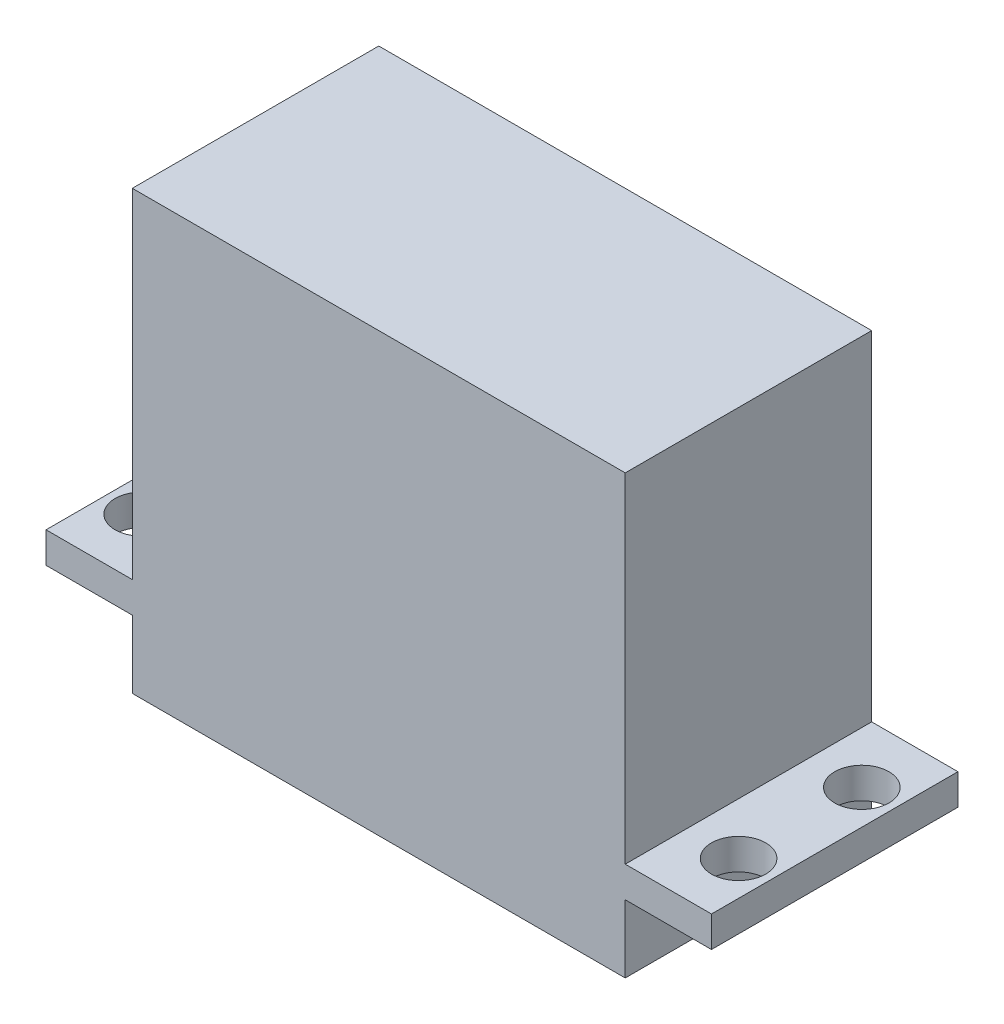
ISO-10303-21;
HEADER;
FILE_DESCRIPTION(('STEP AP214'),'2;1');
FILE_NAME('part.step','',(''),(''),'','','');
FILE_SCHEMA(('AUTOMOTIVE_DESIGN { 1 0 10303 214 1 1 1 1 }'));
ENDSEC;
DATA;
#1=APPLICATION_CONTEXT('core data for automotive mechanical design processes');
#2=APPLICATION_PROTOCOL_DEFINITION('international standard','automotive_design',2000,#1);
#3=PRODUCT_CONTEXT('',#1,'mechanical');
#4=PRODUCT('Part','Part','',(#3));
#5=PRODUCT_RELATED_PRODUCT_CATEGORY('part','',(#4));
#6=PRODUCT_DEFINITION_FORMATION('','',#4);
#7=PRODUCT_DEFINITION_CONTEXT('part definition',#1,'design');
#8=PRODUCT_DEFINITION('design','',#6,#7);
#9=PRODUCT_DEFINITION_SHAPE('','',#8);
#10=(LENGTH_UNIT() NAMED_UNIT(*) SI_UNIT(.MILLI.,.METRE.));
#11=(NAMED_UNIT(*) PLANE_ANGLE_UNIT() SI_UNIT($,.RADIAN.));
#12=(NAMED_UNIT(*) SI_UNIT($,.STERADIAN.) SOLID_ANGLE_UNIT());
#13=UNCERTAINTY_MEASURE_WITH_UNIT(LENGTH_MEASURE(1.E-05),#10,'distance_accuracy_value','');
#14=(GEOMETRIC_REPRESENTATION_CONTEXT(3) GLOBAL_UNCERTAINTY_ASSIGNED_CONTEXT((#13)) GLOBAL_UNIT_ASSIGNED_CONTEXT((#10,
#11,#12)) REPRESENTATION_CONTEXT('',''));
#15=CARTESIAN_POINT('',(0.,0.,0.));
#16=DIRECTION('',(0.,0.,1.));
#17=DIRECTION('',(1.,0.,0.));
#18=AXIS2_PLACEMENT_3D('',#15,#16,#17);
#19=CARTESIAN_POINT('',(0.,0.,0.));
#20=DIRECTION('',(0.,1.,0.));
#21=DIRECTION('',(0.,0.,1.));
#22=AXIS2_PLACEMENT_3D('',#19,#20,#21);
#23=PLANE('',#22);
#24=CARTESIAN_POINT('',(24.2,0.,-5.));
#25=DIRECTION('',(0.,1.,0.));
#26=DIRECTION('',(0.,0.,1.));
#27=AXIS2_PLACEMENT_3D('',#24,#25,#26);
#28=CIRCLE('',#27,2.2);
#29=CARTESIAN_POINT('',(24.2,0.,-2.8));
#30=VERTEX_POINT('',#29);
#31=EDGE_CURVE('E165',#30,#30,#28,.T.);
#32=ORIENTED_EDGE('',*,*,#31,.T.);
#33=EDGE_LOOP('',(#32));
#34=FACE_BOUND('',#33,.T.);
#35=CARTESIAN_POINT('',(24.2,0.,5.));
#36=DIRECTION('',(0.,1.,0.));
#37=DIRECTION('',(0.,0.,1.));
#38=AXIS2_PLACEMENT_3D('',#35,#36,#37);
#39=CIRCLE('',#38,2.2);
#40=CARTESIAN_POINT('',(24.2,0.,7.2));
#41=VERTEX_POINT('',#40);
#42=EDGE_CURVE('E168',#41,#41,#39,.T.);
#43=ORIENTED_EDGE('',*,*,#42,.T.);
#44=EDGE_LOOP('',(#43));
#45=FACE_BOUND('',#44,.T.);
#46=DIRECTION('',(0.,0.,1.));
#47=VECTOR('',#46,1.);
#48=CARTESIAN_POINT('',(20.,0.,0.));
#49=LINE('',#48,#47);
#50=CARTESIAN_POINT('',(20.,0.,-10.));
#51=VERTEX_POINT('',#50);
#52=CARTESIAN_POINT('',(20.,0.,10.));
#53=VERTEX_POINT('',#52);
#54=EDGE_CURVE('E52',#51,#53,#49,.T.);
#55=ORIENTED_EDGE('',*,*,#54,.F.);
#56=DIRECTION('',(-1.,0.,0.));
#57=VECTOR('',#56,1.);
#58=CARTESIAN_POINT('',(20.,0.,-10.));
#59=LINE('',#58,#57);
#60=CARTESIAN_POINT('',(27.,0.,-10.));
#61=VERTEX_POINT('',#60);
#62=EDGE_CURVE('E209',#61,#51,#59,.T.);
#63=ORIENTED_EDGE('',*,*,#62,.F.);
#64=DIRECTION('',(0.,0.,-1.));
#65=VECTOR('',#64,1.);
#66=CARTESIAN_POINT('',(27.,0.,10.));
#67=LINE('',#66,#65);
#68=CARTESIAN_POINT('',(27.,0.,10.));
#69=VERTEX_POINT('',#68);
#70=EDGE_CURVE('E176',#69,#61,#67,.T.);
#71=ORIENTED_EDGE('',*,*,#70,.F.);
#72=DIRECTION('',(1.,0.,0.));
#73=VECTOR('',#72,1.);
#74=CARTESIAN_POINT('',(20.,0.,10.));
#75=LINE('',#74,#73);
#76=EDGE_CURVE('E57',#53,#69,#75,.T.);
#77=ORIENTED_EDGE('',*,*,#76,.F.);
#78=EDGE_LOOP('',(#55,#63,#71,#77));
#79=FACE_BOUND('',#78,.T.);
#80=ADVANCED_FACE('F35',(#34,#45,#79),#23,.F.);
#81=CARTESIAN_POINT('',(-24.2,0.,5.));
#82=DIRECTION('',(0.,1.,0.));
#83=DIRECTION('',(0.,0.,1.));
#84=AXIS2_PLACEMENT_3D('',#81,#82,#83);
#85=CIRCLE('',#84,2.2);
#86=CARTESIAN_POINT('',(-24.2,0.,7.2));
#87=VERTEX_POINT('',#86);
#88=EDGE_CURVE('E152',#87,#87,#85,.T.);
#89=ORIENTED_EDGE('',*,*,#88,.T.);
#90=EDGE_LOOP('',(#89));
#91=FACE_BOUND('',#90,.T.);
#92=CARTESIAN_POINT('',(-24.2,0.,-5.));
#93=DIRECTION('',(0.,1.,0.));
#94=DIRECTION('',(0.,0.,1.));
#95=AXIS2_PLACEMENT_3D('',#92,#93,#94);
#96=CIRCLE('',#95,2.2);
#97=CARTESIAN_POINT('',(-24.2,0.,-2.8));
#98=VERTEX_POINT('',#97);
#99=EDGE_CURVE('E161',#98,#98,#96,.T.);
#100=ORIENTED_EDGE('',*,*,#99,.T.);
#101=EDGE_LOOP('',(#100));
#102=FACE_BOUND('',#101,.T.);
#103=DIRECTION('',(0.,0.,-1.));
#104=VECTOR('',#103,1.);
#105=CARTESIAN_POINT('',(-20.,0.,0.));
#106=LINE('',#105,#104);
#107=CARTESIAN_POINT('',(-20.,0.,10.));
#108=VERTEX_POINT('',#107);
#109=CARTESIAN_POINT('',(-20.,0.,-10.));
#110=VERTEX_POINT('',#109);
#111=EDGE_CURVE('E270',#108,#110,#106,.T.);
#112=ORIENTED_EDGE('',*,*,#111,.F.);
#113=CARTESIAN_POINT('',(-27.,0.,10.));
#114=VERTEX_POINT('',#113);
#115=EDGE_CURVE('E148',#114,#108,#75,.T.);
#116=ORIENTED_EDGE('',*,*,#115,.F.);
#117=DIRECTION('',(0.,0.,1.));
#118=VECTOR('',#117,1.);
#119=CARTESIAN_POINT('',(-27.,0.,10.));
#120=LINE('',#119,#118);
#121=CARTESIAN_POINT('',(-27.,0.,-9.99999999999999));
#122=VERTEX_POINT('',#121);
#123=EDGE_CURVE('E171',#122,#114,#120,.T.);
#124=ORIENTED_EDGE('',*,*,#123,.F.);
#125=EDGE_CURVE('E217',#110,#122,#59,.T.);
#126=ORIENTED_EDGE('',*,*,#125,.F.);
#127=EDGE_LOOP('',(#112,#116,#124,#126));
#128=FACE_BOUND('',#127,.T.);
#129=ADVANCED_FACE('F269',(#91,#102,#128),#23,.F.);
#130=CARTESIAN_POINT('',(-20.,30.,10.));
#131=DIRECTION('',(1.,0.,0.));
#132=DIRECTION('',(0.,0.,-1.));
#133=AXIS2_PLACEMENT_3D('',#130,#131,#132);
#134=PLANE('',#133);
#135=DIRECTION('',(0.,-1.,0.));
#136=VECTOR('',#135,1.);
#137=CARTESIAN_POINT('',(-20.,30.,-9.99999999999999));
#138=LINE('',#137,#136);
#139=CARTESIAN_POINT('',(-20.,30.,-9.99999999999999));
#140=VERTEX_POINT('',#139);
#141=CARTESIAN_POINT('',(-20.,2.5,-9.99999999999999));
#142=VERTEX_POINT('',#141);
#143=EDGE_CURVE('E215',#140,#142,#138,.T.);
#144=ORIENTED_EDGE('',*,*,#143,.T.);
#145=DIRECTION('',(0.,0.,1.));
#146=VECTOR('',#145,1.);
#147=CARTESIAN_POINT('',(-20.,2.5,10.));
#148=LINE('',#147,#146);
#149=CARTESIAN_POINT('',(-20.,2.5,10.));
#150=VERTEX_POINT('',#149);
#151=EDGE_CURVE('E203',#142,#150,#148,.T.);
#152=ORIENTED_EDGE('',*,*,#151,.T.);
#153=DIRECTION('',(0.,-1.,0.));
#154=VECTOR('',#153,1.);
#155=CARTESIAN_POINT('',(-20.,30.,10.));
#156=LINE('',#155,#154);
#157=CARTESIAN_POINT('',(-20.,30.,10.));
#158=VERTEX_POINT('',#157);
#159=EDGE_CURVE('E11',#158,#150,#156,.T.);
#160=ORIENTED_EDGE('',*,*,#159,.F.);
#161=DIRECTION('',(0.,0.,1.));
#162=VECTOR('',#161,1.);
#163=CARTESIAN_POINT('',(-20.,30.,10.));
#164=LINE('',#163,#162);
#165=EDGE_CURVE('E205',#140,#158,#164,.T.);
#166=ORIENTED_EDGE('',*,*,#165,.F.);
#167=EDGE_LOOP('',(#144,#152,#160,#166));
#168=FACE_BOUND('',#167,.T.);
#169=ADVANCED_FACE('F37',(#168),#134,.F.);
#170=CARTESIAN_POINT('',(20.,30.,10.));
#171=DIRECTION('',(0.,0.,-1.));
#172=DIRECTION('',(-1.,0.,0.));
#173=AXIS2_PLACEMENT_3D('',#170,#171,#172);
#174=PLANE('',#173);
#175=ORIENTED_EDGE('',*,*,#159,.T.);
#176=DIRECTION('',(1.,0.,0.));
#177=VECTOR('',#176,1.);
#178=CARTESIAN_POINT('',(27.,2.5,10.));
#179=LINE('',#178,#177);
#180=CARTESIAN_POINT('',(-27.,2.5,10.));
#181=VERTEX_POINT('',#180);
#182=EDGE_CURVE('E177',#181,#150,#179,.T.);
#183=ORIENTED_EDGE('',*,*,#182,.F.);
#184=DIRECTION('',(0.,-1.,0.));
#185=VECTOR('',#184,1.);
#186=CARTESIAN_POINT('',(-27.,2.5,10.));
#187=LINE('',#186,#185);
#188=EDGE_CURVE('E199',#181,#114,#187,.T.);
#189=ORIENTED_EDGE('',*,*,#188,.T.);
#190=ORIENTED_EDGE('',*,*,#115,.T.);
#191=DIRECTION('',(0.,1.,0.));
#192=VECTOR('',#191,1.);
#193=CARTESIAN_POINT('',(-20.,-5.5,10.));
#194=LINE('',#193,#192);
#195=CARTESIAN_POINT('',(-20.,-5.5,10.));
#196=VERTEX_POINT('',#195);
#197=EDGE_CURVE('E129',#196,#108,#194,.T.);
#198=ORIENTED_EDGE('',*,*,#197,.F.);
#199=DIRECTION('',(-1.,0.,0.));
#200=VECTOR('',#199,1.);
#201=CARTESIAN_POINT('',(0.,-5.5,10.));
#202=LINE('',#201,#200);
#203=CARTESIAN_POINT('',(20.,-5.5,10.));
#204=VERTEX_POINT('',#203);
#205=EDGE_CURVE('E135',#204,#196,#202,.T.);
#206=ORIENTED_EDGE('',*,*,#205,.F.);
#207=DIRECTION('',(0.,1.,0.));
#208=VECTOR('',#207,1.);
#209=CARTESIAN_POINT('',(20.,-5.5,10.));
#210=LINE('',#209,#208);
#211=EDGE_CURVE('E280',#204,#53,#210,.T.);
#212=ORIENTED_EDGE('',*,*,#211,.T.);
#213=ORIENTED_EDGE('',*,*,#76,.T.);
#214=DIRECTION('',(0.,-1.,0.));
#215=VECTOR('',#214,1.);
#216=CARTESIAN_POINT('',(27.,2.5,10.));
#217=LINE('',#216,#215);
#218=CARTESIAN_POINT('',(27.,2.5,10.));
#219=VERTEX_POINT('',#218);
#220=EDGE_CURVE('E196',#219,#69,#217,.T.);
#221=ORIENTED_EDGE('',*,*,#220,.F.);
#222=CARTESIAN_POINT('',(20.,2.5,10.));
#223=VERTEX_POINT('',#222);
#224=EDGE_CURVE('E175',#223,#219,#179,.T.);
#225=ORIENTED_EDGE('',*,*,#224,.F.);
#226=DIRECTION('',(0.,-1.,0.));
#227=VECTOR('',#226,1.);
#228=CARTESIAN_POINT('',(20.,30.,10.));
#229=LINE('',#228,#227);
#230=CARTESIAN_POINT('',(20.,30.,10.));
#231=VERTEX_POINT('',#230);
#232=EDGE_CURVE('E44',#231,#223,#229,.T.);
#233=ORIENTED_EDGE('',*,*,#232,.F.);
#234=DIRECTION('',(1.,0.,0.));
#235=VECTOR('',#234,1.);
#236=CARTESIAN_POINT('',(20.,30.,10.));
#237=LINE('',#236,#235);
#238=EDGE_CURVE('E208',#158,#231,#237,.T.);
#239=ORIENTED_EDGE('',*,*,#238,.F.);
#240=EDGE_LOOP('',(#175,#183,#189,#190,#198,#206,#212,#213,#221,#225,#233,#239));
#241=FACE_BOUND('',#240,.T.);
#242=ADVANCED_FACE('F146',(#241),#174,.F.);
#243=CARTESIAN_POINT('',(20.,30.,10.));
#244=DIRECTION('',(-1.,0.,0.));
#245=DIRECTION('',(0.,0.,1.));
#246=AXIS2_PLACEMENT_3D('',#243,#244,#245);
#247=PLANE('',#246);
#248=ORIENTED_EDGE('',*,*,#232,.T.);
#249=DIRECTION('',(0.,0.,-1.));
#250=VECTOR('',#249,1.);
#251=CARTESIAN_POINT('',(20.,2.5,10.));
#252=LINE('',#251,#250);
#253=CARTESIAN_POINT('',(20.,2.5,-10.));
#254=VERTEX_POINT('',#253);
#255=EDGE_CURVE('E201',#223,#254,#252,.T.);
#256=ORIENTED_EDGE('',*,*,#255,.T.);
#257=DIRECTION('',(0.,-1.,0.));
#258=VECTOR('',#257,1.);
#259=CARTESIAN_POINT('',(20.,30.,-10.));
#260=LINE('',#259,#258);
#261=CARTESIAN_POINT('',(20.,30.,-10.));
#262=VERTEX_POINT('',#261);
#263=EDGE_CURVE('E220',#262,#254,#260,.T.);
#264=ORIENTED_EDGE('',*,*,#263,.F.);
#265=DIRECTION('',(0.,0.,-1.));
#266=VECTOR('',#265,1.);
#267=CARTESIAN_POINT('',(20.,30.,10.));
#268=LINE('',#267,#266);
#269=EDGE_CURVE('E211',#231,#262,#268,.T.);
#270=ORIENTED_EDGE('',*,*,#269,.F.);
#271=EDGE_LOOP('',(#248,#256,#264,#270));
#272=FACE_BOUND('',#271,.T.);
#273=ADVANCED_FACE('F253',(#272),#247,.F.);
#274=CARTESIAN_POINT('',(20.,30.,-10.));
#275=DIRECTION('',(0.,0.,1.));
#276=DIRECTION('',(1.,0.,0.));
#277=AXIS2_PLACEMENT_3D('',#274,#275,#276);
#278=PLANE('',#277);
#279=ORIENTED_EDGE('',*,*,#263,.T.);
#280=DIRECTION('',(-1.,0.,0.));
#281=VECTOR('',#280,1.);
#282=CARTESIAN_POINT('',(27.,2.5,-10.));
#283=LINE('',#282,#281);
#284=CARTESIAN_POINT('',(27.,2.5,-10.));
#285=VERTEX_POINT('',#284);
#286=EDGE_CURVE('E183',#285,#254,#283,.T.);
#287=ORIENTED_EDGE('',*,*,#286,.F.);
#288=DIRECTION('',(0.,-1.,0.));
#289=VECTOR('',#288,1.);
#290=CARTESIAN_POINT('',(27.,2.5,-10.));
#291=LINE('',#290,#289);
#292=EDGE_CURVE('E193',#285,#61,#291,.T.);
#293=ORIENTED_EDGE('',*,*,#292,.T.);
#294=ORIENTED_EDGE('',*,*,#62,.T.);
#295=DIRECTION('',(0.,1.,0.));
#296=VECTOR('',#295,1.);
#297=CARTESIAN_POINT('',(20.,-5.5,-10.));
#298=LINE('',#297,#296);
#299=CARTESIAN_POINT('',(20.,-5.5,-10.));
#300=VERTEX_POINT('',#299);
#301=EDGE_CURVE('E154',#300,#51,#298,.T.);
#302=ORIENTED_EDGE('',*,*,#301,.F.);
#303=DIRECTION('',(1.,0.,0.));
#304=VECTOR('',#303,1.);
#305=CARTESIAN_POINT('',(0.,-5.5,-10.));
#306=LINE('',#305,#304);
#307=CARTESIAN_POINT('',(-20.,-5.5,-10.));
#308=VERTEX_POINT('',#307);
#309=EDGE_CURVE('E134',#308,#300,#306,.T.);
#310=ORIENTED_EDGE('',*,*,#309,.F.);
#311=DIRECTION('',(0.,1.,0.));
#312=VECTOR('',#311,1.);
#313=CARTESIAN_POINT('',(-20.,-5.5,-10.));
#314=LINE('',#313,#312);
#315=EDGE_CURVE('E131',#308,#110,#314,.T.);
#316=ORIENTED_EDGE('',*,*,#315,.T.);
#317=ORIENTED_EDGE('',*,*,#125,.T.);
#318=DIRECTION('',(0.,-1.,0.));
#319=VECTOR('',#318,1.);
#320=CARTESIAN_POINT('',(-27.,2.5,-9.99999999999999));
#321=LINE('',#320,#319);
#322=CARTESIAN_POINT('',(-27.,2.5,-9.99999999999999));
#323=VERTEX_POINT('',#322);
#324=EDGE_CURVE('E186',#323,#122,#321,.T.);
#325=ORIENTED_EDGE('',*,*,#324,.F.);
#326=EDGE_CURVE('E182',#142,#323,#283,.T.);
#327=ORIENTED_EDGE('',*,*,#326,.F.);
#328=ORIENTED_EDGE('',*,*,#143,.F.);
#329=DIRECTION('',(-1.,0.,0.));
#330=VECTOR('',#329,1.);
#331=CARTESIAN_POINT('',(20.,30.,-10.));
#332=LINE('',#331,#330);
#333=EDGE_CURVE('E213',#262,#140,#332,.T.);
#334=ORIENTED_EDGE('',*,*,#333,.F.);
#335=EDGE_LOOP('',(#279,#287,#293,#294,#302,#310,#316,#317,#325,#327,#328,#334));
#336=FACE_BOUND('',#335,.T.);
#337=ADVANCED_FACE('F250',(#336),#278,.F.);
#338=CARTESIAN_POINT('',(0.,30.,0.));
#339=DIRECTION('',(0.,1.,0.));
#340=DIRECTION('',(0.,0.,1.));
#341=AXIS2_PLACEMENT_3D('',#338,#339,#340);
#342=PLANE('',#341);
#343=ORIENTED_EDGE('',*,*,#165,.T.);
#344=ORIENTED_EDGE('',*,*,#238,.T.);
#345=ORIENTED_EDGE('',*,*,#269,.T.);
#346=ORIENTED_EDGE('',*,*,#333,.T.);
#347=EDGE_LOOP('',(#343,#344,#345,#346));
#348=FACE_BOUND('',#347,.T.);
#349=ADVANCED_FACE('F255',(#348),#342,.T.);
#350=CARTESIAN_POINT('',(27.,2.5,10.));
#351=DIRECTION('',(-1.,0.,0.));
#352=DIRECTION('',(0.,0.,1.));
#353=AXIS2_PLACEMENT_3D('',#350,#351,#352);
#354=PLANE('',#353);
#355=ORIENTED_EDGE('',*,*,#70,.T.);
#356=ORIENTED_EDGE('',*,*,#292,.F.);
#357=DIRECTION('',(0.,0.,-1.));
#358=VECTOR('',#357,1.);
#359=CARTESIAN_POINT('',(27.,2.5,10.));
#360=LINE('',#359,#358);
#361=EDGE_CURVE('E180',#219,#285,#360,.T.);
#362=ORIENTED_EDGE('',*,*,#361,.F.);
#363=ORIENTED_EDGE('',*,*,#220,.T.);
#364=EDGE_LOOP('',(#355,#356,#362,#363));
#365=FACE_BOUND('',#364,.T.);
#366=ADVANCED_FACE('F235',(#365),#354,.F.);
#367=CARTESIAN_POINT('',(0.,2.5,0.));
#368=DIRECTION('',(0.,1.,0.));
#369=DIRECTION('',(0.,0.,1.));
#370=AXIS2_PLACEMENT_3D('',#367,#368,#369);
#371=PLANE('',#370);
#372=CARTESIAN_POINT('',(24.2,2.5,5.));
#373=DIRECTION('',(0.,1.,0.));
#374=DIRECTION('',(0.,0.,1.));
#375=AXIS2_PLACEMENT_3D('',#372,#373,#374);
#376=CIRCLE('',#375,2.2);
#377=CARTESIAN_POINT('',(24.2,2.5,7.2));
#378=VERTEX_POINT('',#377);
#379=EDGE_CURVE('E39',#378,#378,#376,.T.);
#380=ORIENTED_EDGE('',*,*,#379,.F.);
#381=EDGE_LOOP('',(#380));
#382=FACE_BOUND('',#381,.T.);
#383=CARTESIAN_POINT('',(24.2,2.5,-5.));
#384=DIRECTION('',(0.,1.,0.));
#385=DIRECTION('',(0.,0.,1.));
#386=AXIS2_PLACEMENT_3D('',#383,#384,#385);
#387=CIRCLE('',#386,2.2);
#388=CARTESIAN_POINT('',(24.2,2.5,-2.8));
#389=VERTEX_POINT('',#388);
#390=EDGE_CURVE('E164',#389,#389,#387,.T.);
#391=ORIENTED_EDGE('',*,*,#390,.F.);
#392=EDGE_LOOP('',(#391));
#393=FACE_BOUND('',#392,.T.);
#394=ORIENTED_EDGE('',*,*,#255,.F.);
#395=ORIENTED_EDGE('',*,*,#224,.T.);
#396=ORIENTED_EDGE('',*,*,#361,.T.);
#397=ORIENTED_EDGE('',*,*,#286,.T.);
#398=EDGE_LOOP('',(#394,#395,#396,#397));
#399=FACE_BOUND('',#398,.T.);
#400=ADVANCED_FACE('F231',(#382,#393,#399),#371,.T.);
#401=CARTESIAN_POINT('',(-24.2,2.5,-5.));
#402=DIRECTION('',(0.,1.,0.));
#403=DIRECTION('',(0.,0.,1.));
#404=AXIS2_PLACEMENT_3D('',#401,#402,#403);
#405=CIRCLE('',#404,2.2);
#406=CARTESIAN_POINT('',(-24.2,2.5,-2.8));
#407=VERTEX_POINT('',#406);
#408=EDGE_CURVE('E160',#407,#407,#405,.T.);
#409=ORIENTED_EDGE('',*,*,#408,.F.);
#410=EDGE_LOOP('',(#409));
#411=FACE_BOUND('',#410,.T.);
#412=CARTESIAN_POINT('',(-24.2,2.5,5.));
#413=DIRECTION('',(0.,1.,0.));
#414=DIRECTION('',(0.,0.,1.));
#415=AXIS2_PLACEMENT_3D('',#412,#413,#414);
#416=CIRCLE('',#415,2.2);
#417=CARTESIAN_POINT('',(-24.2,2.5,7.2));
#418=VERTEX_POINT('',#417);
#419=EDGE_CURVE('E149',#418,#418,#416,.T.);
#420=ORIENTED_EDGE('',*,*,#419,.F.);
#421=EDGE_LOOP('',(#420));
#422=FACE_BOUND('',#421,.T.);
#423=ORIENTED_EDGE('',*,*,#151,.F.);
#424=ORIENTED_EDGE('',*,*,#326,.T.);
#425=DIRECTION('',(0.,0.,1.));
#426=VECTOR('',#425,1.);
#427=CARTESIAN_POINT('',(-27.,2.5,10.));
#428=LINE('',#427,#426);
#429=EDGE_CURVE('E172',#323,#181,#428,.T.);
#430=ORIENTED_EDGE('',*,*,#429,.T.);
#431=ORIENTED_EDGE('',*,*,#182,.T.);
#432=EDGE_LOOP('',(#423,#424,#430,#431));
#433=FACE_BOUND('',#432,.T.);
#434=ADVANCED_FACE('F234',(#411,#422,#433),#371,.T.);
#435=CARTESIAN_POINT('',(-27.,2.5,10.));
#436=DIRECTION('',(1.,0.,0.));
#437=DIRECTION('',(0.,0.,-1.));
#438=AXIS2_PLACEMENT_3D('',#435,#436,#437);
#439=PLANE('',#438);
#440=ORIENTED_EDGE('',*,*,#123,.T.);
#441=ORIENTED_EDGE('',*,*,#188,.F.);
#442=ORIENTED_EDGE('',*,*,#429,.F.);
#443=ORIENTED_EDGE('',*,*,#324,.T.);
#444=EDGE_LOOP('',(#440,#441,#442,#443));
#445=FACE_BOUND('',#444,.T.);
#446=ADVANCED_FACE('F266',(#445),#439,.F.);
#447=CARTESIAN_POINT('',(-24.2,-1.2E-05,5.));
#448=DIRECTION('',(0.,1.,0.));
#449=DIRECTION('',(0.,0.,1.));
#450=AXIS2_PLACEMENT_3D('',#447,#448,#449);
#451=CYLINDRICAL_SURFACE('',#450,2.2);
#452=CARTESIAN_POINT('',(-24.2,2.5,7.2));
#453=CARTESIAN_POINT('',(-24.2,2.47395833333333,7.2));
#454=CARTESIAN_POINT('',(-24.2,2.44791666666667,7.2));
#455=CARTESIAN_POINT('',(-24.2,2.39583333333333,7.2));
#456=CARTESIAN_POINT('',(-24.2,2.36979166666667,7.2));
#457=CARTESIAN_POINT('',(-24.2,2.31770833333333,7.2));
#458=CARTESIAN_POINT('',(-24.2,2.29166666666667,7.2));
#459=CARTESIAN_POINT('',(-24.2,2.23958333333333,7.2));
#460=CARTESIAN_POINT('',(-24.2,2.21354166666667,7.2));
#461=CARTESIAN_POINT('',(-24.2,2.16145833333333,7.2));
#462=CARTESIAN_POINT('',(-24.2,2.13541666666667,7.2));
#463=CARTESIAN_POINT('',(-24.2,2.08333333333333,7.2));
#464=CARTESIAN_POINT('',(-24.2,2.05729166666667,7.2));
#465=CARTESIAN_POINT('',(-24.2,2.00520833333333,7.2));
#466=CARTESIAN_POINT('',(-24.2,1.97916666666667,7.2));
#467=CARTESIAN_POINT('',(-24.2,1.92708333333333,7.2));
#468=CARTESIAN_POINT('',(-24.2,1.90104166666667,7.2));
#469=CARTESIAN_POINT('',(-24.2,1.84895833333333,7.2));
#470=CARTESIAN_POINT('',(-24.2,1.82291666666667,7.2));
#471=CARTESIAN_POINT('',(-24.2,1.77083333333333,7.2));
#472=CARTESIAN_POINT('',(-24.2,1.74479166666667,7.2));
#473=CARTESIAN_POINT('',(-24.2,1.69270833333333,7.2));
#474=CARTESIAN_POINT('',(-24.2,1.66666666666667,7.2));
#475=CARTESIAN_POINT('',(-24.2,1.61458333333333,7.2));
#476=CARTESIAN_POINT('',(-24.2,1.58854166666667,7.2));
#477=CARTESIAN_POINT('',(-24.2,1.53645833333333,7.2));
#478=CARTESIAN_POINT('',(-24.2,1.51041666666667,7.2));
#479=CARTESIAN_POINT('',(-24.2,1.45833333333333,7.2));
#480=CARTESIAN_POINT('',(-24.2,1.43229166666667,7.2));
#481=CARTESIAN_POINT('',(-24.2,1.38020833333333,7.2));
#482=CARTESIAN_POINT('',(-24.2,1.35416666666667,7.2));
#483=CARTESIAN_POINT('',(-24.2,1.30208333333333,7.2));
#484=CARTESIAN_POINT('',(-24.2,1.27604166666667,7.2));
#485=CARTESIAN_POINT('',(-24.2,1.22395833333333,7.2));
#486=CARTESIAN_POINT('',(-24.2,1.19791666666667,7.2));
#487=CARTESIAN_POINT('',(-24.2,1.14583333333333,7.2));
#488=CARTESIAN_POINT('',(-24.2,1.11979166666667,7.2));
#489=CARTESIAN_POINT('',(-24.2,1.06770833333333,7.2));
#490=CARTESIAN_POINT('',(-24.2,1.04166666666667,7.2));
#491=CARTESIAN_POINT('',(-24.2,0.989583333333333,7.2));
#492=CARTESIAN_POINT('',(-24.2,0.963541666666667,7.2));
#493=CARTESIAN_POINT('',(-24.2,0.911458333333333,7.2));
#494=CARTESIAN_POINT('',(-24.2,0.885416666666667,7.2));
#495=CARTESIAN_POINT('',(-24.2,0.833333333333333,7.2));
#496=CARTESIAN_POINT('',(-24.2,0.807291666666667,7.2));
#497=CARTESIAN_POINT('',(-24.2,0.755208333333333,7.2));
#498=CARTESIAN_POINT('',(-24.2,0.729166666666667,7.2));
#499=CARTESIAN_POINT('',(-24.2,0.677083333333333,7.2));
#500=CARTESIAN_POINT('',(-24.2,0.651041666666667,7.2));
#501=CARTESIAN_POINT('',(-24.2,0.598958333333333,7.2));
#502=CARTESIAN_POINT('',(-24.2,0.572916666666667,7.2));
#503=CARTESIAN_POINT('',(-24.2,0.520833333333333,7.2));
#504=CARTESIAN_POINT('',(-24.2,0.494791666666667,7.2));
#505=CARTESIAN_POINT('',(-24.2,0.442708333333333,7.2));
#506=CARTESIAN_POINT('',(-24.2,0.416666666666667,7.2));
#507=CARTESIAN_POINT('',(-24.2,0.364583333333333,7.2));
#508=CARTESIAN_POINT('',(-24.2,0.338541666666667,7.2));
#509=CARTESIAN_POINT('',(-24.2,0.286458333333333,7.2));
#510=CARTESIAN_POINT('',(-24.2,0.260416666666667,7.2));
#511=CARTESIAN_POINT('',(-24.2,0.208333333333334,7.2));
#512=CARTESIAN_POINT('',(-24.2,0.182291666666667,7.2));
#513=CARTESIAN_POINT('',(-24.2,0.130208333333334,7.2));
#514=CARTESIAN_POINT('',(-24.2,0.104166666666667,7.2));
#515=CARTESIAN_POINT('',(-24.2,0.0520833333333336,7.2));
#516=CARTESIAN_POINT('',(-24.2,0.0260416666666669,7.2));
#517=CARTESIAN_POINT('',(-24.2,0.,7.2));
#518=B_SPLINE_CURVE_WITH_KNOTS('',3,(#452,#453,#454,#455,#456,#457,#458,#459,#460,#461,#462,
#463,#464,#465,#466,#467,#468,#469,#470,#471,#472,#473,#474,#475,#476,#477,#478,#479,#480,#481,
#482,#483,#484,#485,#486,#487,#488,#489,#490,#491,#492,#493,#494,#495,#496,#497,#498,#499,#500,
#501,#502,#503,#504,#505,#506,#507,#508,#509,#510,#511,#512,#513,#514,#515,#516,#517),
.UNSPECIFIED.,.F.,.F.,(4,2,2,2,2,2,2,2,2,2,2,2,2,2,2,2,2,2,2,2,2,2,2,2,2,2,2,2,2,2,2,2,4),(0.,
0.0781250000000001,0.15625,0.234375,0.3125,0.390625,0.46875,0.546875,0.625,0.703125,0.78125,
0.859374999999999,0.9375,1.015625,1.09375,1.171875,1.25,1.328125,1.40625,1.484375,1.5625,
1.640625,1.71875,1.796875,1.875,1.953125,2.03125,2.109375,2.1875,2.265625,2.34375,2.421875,2.5),.UNSPECIFIED.);
#519=EDGE_CURVE('BSEAM386',#418,#87,#518,.T.);
#520=ORIENTED_EDGE('',*,*,#419,.T.);
#521=ORIENTED_EDGE('',*,*,#88,.F.);
#522=ORIENTED_EDGE('',*,*,#519,.T.);
#523=ORIENTED_EDGE('',*,*,#519,.F.);
#524=EDGE_LOOP('',(#520,#522,#521,#523));
#525=FACE_BOUND('',#524,.T.);
#526=ADVANCED_FACE('F386',(#525),#451,.F.);
#527=CARTESIAN_POINT('',(-24.2,-1.2E-05,-5.));
#528=DIRECTION('',(0.,1.,0.));
#529=DIRECTION('',(0.,0.,1.));
#530=AXIS2_PLACEMENT_3D('',#527,#528,#529);
#531=CYLINDRICAL_SURFACE('',#530,2.2);
#532=CARTESIAN_POINT('',(-24.2,2.5,-2.8));
#533=CARTESIAN_POINT('',(-24.2,2.47395833333333,-2.8));
#534=CARTESIAN_POINT('',(-24.2,2.44791666666667,-2.8));
#535=CARTESIAN_POINT('',(-24.2,2.39583333333333,-2.8));
#536=CARTESIAN_POINT('',(-24.2,2.36979166666667,-2.8));
#537=CARTESIAN_POINT('',(-24.2,2.31770833333333,-2.8));
#538=CARTESIAN_POINT('',(-24.2,2.29166666666667,-2.8));
#539=CARTESIAN_POINT('',(-24.2,2.23958333333333,-2.8));
#540=CARTESIAN_POINT('',(-24.2,2.21354166666667,-2.8));
#541=CARTESIAN_POINT('',(-24.2,2.16145833333333,-2.8));
#542=CARTESIAN_POINT('',(-24.2,2.13541666666667,-2.8));
#543=CARTESIAN_POINT('',(-24.2,2.08333333333333,-2.8));
#544=CARTESIAN_POINT('',(-24.2,2.05729166666667,-2.8));
#545=CARTESIAN_POINT('',(-24.2,2.00520833333333,-2.8));
#546=CARTESIAN_POINT('',(-24.2,1.97916666666667,-2.8));
#547=CARTESIAN_POINT('',(-24.2,1.92708333333333,-2.8));
#548=CARTESIAN_POINT('',(-24.2,1.90104166666667,-2.8));
#549=CARTESIAN_POINT('',(-24.2,1.84895833333333,-2.8));
#550=CARTESIAN_POINT('',(-24.2,1.82291666666667,-2.8));
#551=CARTESIAN_POINT('',(-24.2,1.77083333333333,-2.8));
#552=CARTESIAN_POINT('',(-24.2,1.74479166666667,-2.8));
#553=CARTESIAN_POINT('',(-24.2,1.69270833333333,-2.8));
#554=CARTESIAN_POINT('',(-24.2,1.66666666666667,-2.8));
#555=CARTESIAN_POINT('',(-24.2,1.61458333333333,-2.8));
#556=CARTESIAN_POINT('',(-24.2,1.58854166666667,-2.8));
#557=CARTESIAN_POINT('',(-24.2,1.53645833333333,-2.8));
#558=CARTESIAN_POINT('',(-24.2,1.51041666666667,-2.8));
#559=CARTESIAN_POINT('',(-24.2,1.45833333333333,-2.8));
#560=CARTESIAN_POINT('',(-24.2,1.43229166666667,-2.8));
#561=CARTESIAN_POINT('',(-24.2,1.38020833333333,-2.8));
#562=CARTESIAN_POINT('',(-24.2,1.35416666666667,-2.8));
#563=CARTESIAN_POINT('',(-24.2,1.30208333333333,-2.8));
#564=CARTESIAN_POINT('',(-24.2,1.27604166666667,-2.8));
#565=CARTESIAN_POINT('',(-24.2,1.22395833333333,-2.8));
#566=CARTESIAN_POINT('',(-24.2,1.19791666666667,-2.8));
#567=CARTESIAN_POINT('',(-24.2,1.14583333333333,-2.8));
#568=CARTESIAN_POINT('',(-24.2,1.11979166666667,-2.8));
#569=CARTESIAN_POINT('',(-24.2,1.06770833333333,-2.8));
#570=CARTESIAN_POINT('',(-24.2,1.04166666666667,-2.8));
#571=CARTESIAN_POINT('',(-24.2,0.989583333333333,-2.8));
#572=CARTESIAN_POINT('',(-24.2,0.963541666666667,-2.8));
#573=CARTESIAN_POINT('',(-24.2,0.911458333333333,-2.8));
#574=CARTESIAN_POINT('',(-24.2,0.885416666666667,-2.8));
#575=CARTESIAN_POINT('',(-24.2,0.833333333333333,-2.8));
#576=CARTESIAN_POINT('',(-24.2,0.807291666666667,-2.8));
#577=CARTESIAN_POINT('',(-24.2,0.755208333333333,-2.8));
#578=CARTESIAN_POINT('',(-24.2,0.729166666666667,-2.8));
#579=CARTESIAN_POINT('',(-24.2,0.677083333333333,-2.8));
#580=CARTESIAN_POINT('',(-24.2,0.651041666666667,-2.8));
#581=CARTESIAN_POINT('',(-24.2,0.598958333333333,-2.8));
#582=CARTESIAN_POINT('',(-24.2,0.572916666666667,-2.8));
#583=CARTESIAN_POINT('',(-24.2,0.520833333333333,-2.8));
#584=CARTESIAN_POINT('',(-24.2,0.494791666666667,-2.8));
#585=CARTESIAN_POINT('',(-24.2,0.442708333333333,-2.8));
#586=CARTESIAN_POINT('',(-24.2,0.416666666666667,-2.8));
#587=CARTESIAN_POINT('',(-24.2,0.364583333333333,-2.8));
#588=CARTESIAN_POINT('',(-24.2,0.338541666666667,-2.8));
#589=CARTESIAN_POINT('',(-24.2,0.286458333333333,-2.8));
#590=CARTESIAN_POINT('',(-24.2,0.260416666666667,-2.8));
#591=CARTESIAN_POINT('',(-24.2,0.208333333333334,-2.8));
#592=CARTESIAN_POINT('',(-24.2,0.182291666666667,-2.8));
#593=CARTESIAN_POINT('',(-24.2,0.130208333333334,-2.8));
#594=CARTESIAN_POINT('',(-24.2,0.104166666666667,-2.8));
#595=CARTESIAN_POINT('',(-24.2,0.0520833333333336,-2.8));
#596=CARTESIAN_POINT('',(-24.2,0.0260416666666669,-2.8));
#597=CARTESIAN_POINT('',(-24.2,0.,-2.8));
#598=B_SPLINE_CURVE_WITH_KNOTS('',3,(#532,#533,#534,#535,#536,#537,#538,#539,#540,#541,#542,
#543,#544,#545,#546,#547,#548,#549,#550,#551,#552,#553,#554,#555,#556,#557,#558,#559,#560,#561,
#562,#563,#564,#565,#566,#567,#568,#569,#570,#571,#572,#573,#574,#575,#576,#577,#578,#579,#580,
#581,#582,#583,#584,#585,#586,#587,#588,#589,#590,#591,#592,#593,#594,#595,#596,#597),
.UNSPECIFIED.,.F.,.F.,(4,2,2,2,2,2,2,2,2,2,2,2,2,2,2,2,2,2,2,2,2,2,2,2,2,2,2,2,2,2,2,2,4),(0.,
0.0781250000000001,0.15625,0.234375,0.3125,0.390625,0.46875,0.546875,0.625,0.703125,0.78125,
0.859374999999999,0.9375,1.015625,1.09375,1.171875,1.25,1.328125,1.40625,1.484375,1.5625,
1.640625,1.71875,1.796875,1.875,1.953125,2.03125,2.109375,2.1875,2.265625,2.34375,2.421875,2.5),.UNSPECIFIED.);
#599=EDGE_CURVE('BSEAM383',#407,#98,#598,.T.);
#600=ORIENTED_EDGE('',*,*,#408,.T.);
#601=ORIENTED_EDGE('',*,*,#99,.F.);
#602=ORIENTED_EDGE('',*,*,#599,.T.);
#603=ORIENTED_EDGE('',*,*,#599,.F.);
#604=EDGE_LOOP('',(#600,#602,#601,#603));
#605=FACE_BOUND('',#604,.T.);
#606=ADVANCED_FACE('F383',(#605),#531,.F.);
#607=CARTESIAN_POINT('',(24.2,-1.2E-05,-5.));
#608=DIRECTION('',(0.,1.,0.));
#609=DIRECTION('',(0.,0.,1.));
#610=AXIS2_PLACEMENT_3D('',#607,#608,#609);
#611=CYLINDRICAL_SURFACE('',#610,2.2);
#612=CARTESIAN_POINT('',(24.2,2.5,-2.8));
#613=CARTESIAN_POINT('',(24.2,2.47395833333333,-2.8));
#614=CARTESIAN_POINT('',(24.2,2.44791666666667,-2.8));
#615=CARTESIAN_POINT('',(24.2,2.39583333333333,-2.8));
#616=CARTESIAN_POINT('',(24.2,2.36979166666667,-2.8));
#617=CARTESIAN_POINT('',(24.2,2.31770833333333,-2.8));
#618=CARTESIAN_POINT('',(24.2,2.29166666666667,-2.8));
#619=CARTESIAN_POINT('',(24.2,2.23958333333333,-2.8));
#620=CARTESIAN_POINT('',(24.2,2.21354166666667,-2.8));
#621=CARTESIAN_POINT('',(24.2,2.16145833333333,-2.8));
#622=CARTESIAN_POINT('',(24.2,2.13541666666667,-2.8));
#623=CARTESIAN_POINT('',(24.2,2.08333333333333,-2.8));
#624=CARTESIAN_POINT('',(24.2,2.05729166666667,-2.8));
#625=CARTESIAN_POINT('',(24.2,2.00520833333333,-2.8));
#626=CARTESIAN_POINT('',(24.2,1.97916666666667,-2.8));
#627=CARTESIAN_POINT('',(24.2,1.92708333333333,-2.8));
#628=CARTESIAN_POINT('',(24.2,1.90104166666667,-2.8));
#629=CARTESIAN_POINT('',(24.2,1.84895833333333,-2.8));
#630=CARTESIAN_POINT('',(24.2,1.82291666666667,-2.8));
#631=CARTESIAN_POINT('',(24.2,1.77083333333333,-2.8));
#632=CARTESIAN_POINT('',(24.2,1.74479166666667,-2.8));
#633=CARTESIAN_POINT('',(24.2,1.69270833333333,-2.8));
#634=CARTESIAN_POINT('',(24.2,1.66666666666667,-2.8));
#635=CARTESIAN_POINT('',(24.2,1.61458333333333,-2.8));
#636=CARTESIAN_POINT('',(24.2,1.58854166666667,-2.8));
#637=CARTESIAN_POINT('',(24.2,1.53645833333333,-2.8));
#638=CARTESIAN_POINT('',(24.2,1.51041666666667,-2.8));
#639=CARTESIAN_POINT('',(24.2,1.45833333333333,-2.8));
#640=CARTESIAN_POINT('',(24.2,1.43229166666667,-2.8));
#641=CARTESIAN_POINT('',(24.2,1.38020833333333,-2.8));
#642=CARTESIAN_POINT('',(24.2,1.35416666666667,-2.8));
#643=CARTESIAN_POINT('',(24.2,1.30208333333333,-2.8));
#644=CARTESIAN_POINT('',(24.2,1.27604166666667,-2.8));
#645=CARTESIAN_POINT('',(24.2,1.22395833333333,-2.8));
#646=CARTESIAN_POINT('',(24.2,1.19791666666667,-2.8));
#647=CARTESIAN_POINT('',(24.2,1.14583333333333,-2.8));
#648=CARTESIAN_POINT('',(24.2,1.11979166666667,-2.8));
#649=CARTESIAN_POINT('',(24.2,1.06770833333333,-2.8));
#650=CARTESIAN_POINT('',(24.2,1.04166666666667,-2.8));
#651=CARTESIAN_POINT('',(24.2,0.989583333333333,-2.8));
#652=CARTESIAN_POINT('',(24.2,0.963541666666667,-2.8));
#653=CARTESIAN_POINT('',(24.2,0.911458333333333,-2.8));
#654=CARTESIAN_POINT('',(24.2,0.885416666666667,-2.8));
#655=CARTESIAN_POINT('',(24.2,0.833333333333333,-2.8));
#656=CARTESIAN_POINT('',(24.2,0.807291666666667,-2.8));
#657=CARTESIAN_POINT('',(24.2,0.755208333333333,-2.8));
#658=CARTESIAN_POINT('',(24.2,0.729166666666667,-2.8));
#659=CARTESIAN_POINT('',(24.2,0.677083333333333,-2.8));
#660=CARTESIAN_POINT('',(24.2,0.651041666666667,-2.8));
#661=CARTESIAN_POINT('',(24.2,0.598958333333333,-2.8));
#662=CARTESIAN_POINT('',(24.2,0.572916666666667,-2.8));
#663=CARTESIAN_POINT('',(24.2,0.520833333333333,-2.8));
#664=CARTESIAN_POINT('',(24.2,0.494791666666667,-2.8));
#665=CARTESIAN_POINT('',(24.2,0.442708333333333,-2.8));
#666=CARTESIAN_POINT('',(24.2,0.416666666666667,-2.8));
#667=CARTESIAN_POINT('',(24.2,0.364583333333333,-2.8));
#668=CARTESIAN_POINT('',(24.2,0.338541666666667,-2.8));
#669=CARTESIAN_POINT('',(24.2,0.286458333333333,-2.8));
#670=CARTESIAN_POINT('',(24.2,0.260416666666667,-2.8));
#671=CARTESIAN_POINT('',(24.2,0.208333333333334,-2.8));
#672=CARTESIAN_POINT('',(24.2,0.182291666666667,-2.8));
#673=CARTESIAN_POINT('',(24.2,0.130208333333334,-2.8));
#674=CARTESIAN_POINT('',(24.2,0.104166666666667,-2.8));
#675=CARTESIAN_POINT('',(24.2,0.0520833333333336,-2.8));
#676=CARTESIAN_POINT('',(24.2,0.0260416666666669,-2.8));
#677=CARTESIAN_POINT('',(24.2,0.,-2.8));
#678=B_SPLINE_CURVE_WITH_KNOTS('',3,(#612,#613,#614,#615,#616,#617,#618,#619,#620,#621,#622,
#623,#624,#625,#626,#627,#628,#629,#630,#631,#632,#633,#634,#635,#636,#637,#638,#639,#640,#641,
#642,#643,#644,#645,#646,#647,#648,#649,#650,#651,#652,#653,#654,#655,#656,#657,#658,#659,#660,
#661,#662,#663,#664,#665,#666,#667,#668,#669,#670,#671,#672,#673,#674,#675,#676,#677),
.UNSPECIFIED.,.F.,.F.,(4,2,2,2,2,2,2,2,2,2,2,2,2,2,2,2,2,2,2,2,2,2,2,2,2,2,2,2,2,2,2,2,4),(0.,
0.0781250000000001,0.15625,0.234375,0.3125,0.390625,0.46875,0.546875,0.625,0.703125,0.78125,
0.859374999999999,0.9375,1.015625,1.09375,1.171875,1.25,1.328125,1.40625,1.484375,1.5625,
1.640625,1.71875,1.796875,1.875,1.953125,2.03125,2.109375,2.1875,2.265625,2.34375,2.421875,2.5),.UNSPECIFIED.);
#679=EDGE_CURVE('BSEAM228',#389,#30,#678,.T.);
#680=ORIENTED_EDGE('',*,*,#390,.T.);
#681=ORIENTED_EDGE('',*,*,#31,.F.);
#682=ORIENTED_EDGE('',*,*,#679,.T.);
#683=ORIENTED_EDGE('',*,*,#679,.F.);
#684=EDGE_LOOP('',(#680,#682,#681,#683));
#685=FACE_BOUND('',#684,.T.);
#686=ADVANCED_FACE('F228',(#685),#611,.F.);
#687=CARTESIAN_POINT('',(24.2,-1.2E-05,5.));
#688=DIRECTION('',(0.,1.,0.));
#689=DIRECTION('',(0.,0.,1.));
#690=AXIS2_PLACEMENT_3D('',#687,#688,#689);
#691=CYLINDRICAL_SURFACE('',#690,2.2);
#692=CARTESIAN_POINT('',(24.2,2.5,7.2));
#693=CARTESIAN_POINT('',(24.2,2.47395833333333,7.2));
#694=CARTESIAN_POINT('',(24.2,2.44791666666667,7.2));
#695=CARTESIAN_POINT('',(24.2,2.39583333333333,7.2));
#696=CARTESIAN_POINT('',(24.2,2.36979166666667,7.2));
#697=CARTESIAN_POINT('',(24.2,2.31770833333333,7.2));
#698=CARTESIAN_POINT('',(24.2,2.29166666666667,7.2));
#699=CARTESIAN_POINT('',(24.2,2.23958333333333,7.2));
#700=CARTESIAN_POINT('',(24.2,2.21354166666667,7.2));
#701=CARTESIAN_POINT('',(24.2,2.16145833333333,7.2));
#702=CARTESIAN_POINT('',(24.2,2.13541666666667,7.2));
#703=CARTESIAN_POINT('',(24.2,2.08333333333333,7.2));
#704=CARTESIAN_POINT('',(24.2,2.05729166666667,7.2));
#705=CARTESIAN_POINT('',(24.2,2.00520833333333,7.2));
#706=CARTESIAN_POINT('',(24.2,1.97916666666667,7.2));
#707=CARTESIAN_POINT('',(24.2,1.92708333333333,7.2));
#708=CARTESIAN_POINT('',(24.2,1.90104166666667,7.2));
#709=CARTESIAN_POINT('',(24.2,1.84895833333333,7.2));
#710=CARTESIAN_POINT('',(24.2,1.82291666666667,7.2));
#711=CARTESIAN_POINT('',(24.2,1.77083333333333,7.2));
#712=CARTESIAN_POINT('',(24.2,1.74479166666667,7.2));
#713=CARTESIAN_POINT('',(24.2,1.69270833333333,7.2));
#714=CARTESIAN_POINT('',(24.2,1.66666666666667,7.2));
#715=CARTESIAN_POINT('',(24.2,1.61458333333333,7.2));
#716=CARTESIAN_POINT('',(24.2,1.58854166666667,7.2));
#717=CARTESIAN_POINT('',(24.2,1.53645833333333,7.2));
#718=CARTESIAN_POINT('',(24.2,1.51041666666667,7.2));
#719=CARTESIAN_POINT('',(24.2,1.45833333333333,7.2));
#720=CARTESIAN_POINT('',(24.2,1.43229166666667,7.2));
#721=CARTESIAN_POINT('',(24.2,1.38020833333333,7.2));
#722=CARTESIAN_POINT('',(24.2,1.35416666666667,7.2));
#723=CARTESIAN_POINT('',(24.2,1.30208333333333,7.2));
#724=CARTESIAN_POINT('',(24.2,1.27604166666667,7.2));
#725=CARTESIAN_POINT('',(24.2,1.22395833333333,7.2));
#726=CARTESIAN_POINT('',(24.2,1.19791666666667,7.2));
#727=CARTESIAN_POINT('',(24.2,1.14583333333333,7.2));
#728=CARTESIAN_POINT('',(24.2,1.11979166666667,7.2));
#729=CARTESIAN_POINT('',(24.2,1.06770833333333,7.2));
#730=CARTESIAN_POINT('',(24.2,1.04166666666667,7.2));
#731=CARTESIAN_POINT('',(24.2,0.989583333333333,7.2));
#732=CARTESIAN_POINT('',(24.2,0.963541666666667,7.2));
#733=CARTESIAN_POINT('',(24.2,0.911458333333333,7.2));
#734=CARTESIAN_POINT('',(24.2,0.885416666666667,7.2));
#735=CARTESIAN_POINT('',(24.2,0.833333333333333,7.2));
#736=CARTESIAN_POINT('',(24.2,0.807291666666667,7.2));
#737=CARTESIAN_POINT('',(24.2,0.755208333333333,7.2));
#738=CARTESIAN_POINT('',(24.2,0.729166666666667,7.2));
#739=CARTESIAN_POINT('',(24.2,0.677083333333333,7.2));
#740=CARTESIAN_POINT('',(24.2,0.651041666666667,7.2));
#741=CARTESIAN_POINT('',(24.2,0.598958333333333,7.2));
#742=CARTESIAN_POINT('',(24.2,0.572916666666667,7.2));
#743=CARTESIAN_POINT('',(24.2,0.520833333333333,7.2));
#744=CARTESIAN_POINT('',(24.2,0.494791666666667,7.2));
#745=CARTESIAN_POINT('',(24.2,0.442708333333333,7.2));
#746=CARTESIAN_POINT('',(24.2,0.416666666666667,7.2));
#747=CARTESIAN_POINT('',(24.2,0.364583333333333,7.2));
#748=CARTESIAN_POINT('',(24.2,0.338541666666667,7.2));
#749=CARTESIAN_POINT('',(24.2,0.286458333333333,7.2));
#750=CARTESIAN_POINT('',(24.2,0.260416666666667,7.2));
#751=CARTESIAN_POINT('',(24.2,0.208333333333334,7.2));
#752=CARTESIAN_POINT('',(24.2,0.182291666666667,7.2));
#753=CARTESIAN_POINT('',(24.2,0.130208333333334,7.2));
#754=CARTESIAN_POINT('',(24.2,0.104166666666667,7.2));
#755=CARTESIAN_POINT('',(24.2,0.0520833333333336,7.2));
#756=CARTESIAN_POINT('',(24.2,0.0260416666666669,7.2));
#757=CARTESIAN_POINT('',(24.2,0.,7.2));
#758=B_SPLINE_CURVE_WITH_KNOTS('',3,(#692,#693,#694,#695,#696,#697,#698,#699,#700,#701,#702,
#703,#704,#705,#706,#707,#708,#709,#710,#711,#712,#713,#714,#715,#716,#717,#718,#719,#720,#721,
#722,#723,#724,#725,#726,#727,#728,#729,#730,#731,#732,#733,#734,#735,#736,#737,#738,#739,#740,
#741,#742,#743,#744,#745,#746,#747,#748,#749,#750,#751,#752,#753,#754,#755,#756,#757),
.UNSPECIFIED.,.F.,.F.,(4,2,2,2,2,2,2,2,2,2,2,2,2,2,2,2,2,2,2,2,2,2,2,2,2,2,2,2,2,2,2,2,4),(0.,
0.0781250000000001,0.15625,0.234375,0.3125,0.390625,0.46875,0.546875,0.625,0.703125,0.78125,
0.859374999999999,0.9375,1.015625,1.09375,1.171875,1.25,1.328125,1.40625,1.484375,1.5625,
1.640625,1.71875,1.796875,1.875,1.953125,2.03125,2.109375,2.1875,2.265625,2.34375,2.421875,2.5),.UNSPECIFIED.);
#759=EDGE_CURVE('BSEAM338',#378,#41,#758,.T.);
#760=ORIENTED_EDGE('',*,*,#379,.T.);
#761=ORIENTED_EDGE('',*,*,#42,.F.);
#762=ORIENTED_EDGE('',*,*,#759,.T.);
#763=ORIENTED_EDGE('',*,*,#759,.F.);
#764=EDGE_LOOP('',(#760,#762,#761,#763));
#765=FACE_BOUND('',#764,.T.);
#766=ADVANCED_FACE('F338',(#765),#691,.F.);
#767=CARTESIAN_POINT('',(-20.,-5.5,0.));
#768=DIRECTION('',(1.,0.,0.));
#769=DIRECTION('',(0.,0.,-1.));
#770=AXIS2_PLACEMENT_3D('',#767,#768,#769);
#771=PLANE('',#770);
#772=ORIENTED_EDGE('',*,*,#111,.T.);
#773=ORIENTED_EDGE('',*,*,#315,.F.);
#774=DIRECTION('',(0.,0.,-1.));
#775=VECTOR('',#774,1.);
#776=CARTESIAN_POINT('',(-20.,-5.5,0.));
#777=LINE('',#776,#775);
#778=EDGE_CURVE('E124',#196,#308,#777,.T.);
#779=ORIENTED_EDGE('',*,*,#778,.F.);
#780=ORIENTED_EDGE('',*,*,#197,.T.);
#781=EDGE_LOOP('',(#772,#773,#779,#780));
#782=FACE_BOUND('',#781,.T.);
#783=ADVANCED_FACE('F127',(#782),#771,.F.);
#784=CARTESIAN_POINT('',(20.,-5.5,0.));
#785=DIRECTION('',(-1.,0.,0.));
#786=DIRECTION('',(0.,0.,1.));
#787=AXIS2_PLACEMENT_3D('',#784,#785,#786);
#788=PLANE('',#787);
#789=ORIENTED_EDGE('',*,*,#54,.T.);
#790=ORIENTED_EDGE('',*,*,#211,.F.);
#791=DIRECTION('',(0.,0.,1.));
#792=VECTOR('',#791,1.);
#793=CARTESIAN_POINT('',(20.,-5.5,0.));
#794=LINE('',#793,#792);
#795=EDGE_CURVE('E140',#300,#204,#794,.T.);
#796=ORIENTED_EDGE('',*,*,#795,.F.);
#797=ORIENTED_EDGE('',*,*,#301,.T.);
#798=EDGE_LOOP('',(#789,#790,#796,#797));
#799=FACE_BOUND('',#798,.T.);
#800=ADVANCED_FACE('F284',(#799),#788,.F.);
#801=CARTESIAN_POINT('',(0.,-5.5,0.));
#802=DIRECTION('',(0.,-1.,0.));
#803=DIRECTION('',(0.,0.,-1.));
#804=AXIS2_PLACEMENT_3D('',#801,#802,#803);
#805=PLANE('',#804);
#806=CARTESIAN_POINT('',(-10.,-5.5,0.));
#807=DIRECTION('',(0.,-1.,0.));
#808=DIRECTION('',(0.,0.,-1.));
#809=AXIS2_PLACEMENT_3D('',#806,#807,#808);
#810=CIRCLE('',#809,3.);
#811=CARTESIAN_POINT('',(-10.,-5.5,-2.99999999999999));
#812=VERTEX_POINT('',#811);
#813=EDGE_CURVE('E275',#812,#812,#810,.T.);
#814=ORIENTED_EDGE('',*,*,#813,.F.);
#815=EDGE_LOOP('',(#814));
#816=FACE_BOUND('',#815,.T.);
#817=ORIENTED_EDGE('',*,*,#205,.T.);
#818=ORIENTED_EDGE('',*,*,#778,.T.);
#819=ORIENTED_EDGE('',*,*,#309,.T.);
#820=ORIENTED_EDGE('',*,*,#795,.T.);
#821=EDGE_LOOP('',(#817,#818,#819,#820));
#822=FACE_BOUND('',#821,.T.);
#823=ADVANCED_FACE('F138',(#816,#822),#805,.T.);
#824=CARTESIAN_POINT('',(-10.,-12.5,0.));
#825=DIRECTION('',(0.,1.,0.));
#826=DIRECTION('',(0.,0.,1.));
#827=AXIS2_PLACEMENT_3D('',#824,#825,#826);
#828=CYLINDRICAL_SURFACE('',#827,3.);
#829=CARTESIAN_POINT('',(-10.,-12.5,0.));
#830=DIRECTION('',(0.,-1.,0.));
#831=DIRECTION('',(0.,0.,-1.));
#832=AXIS2_PLACEMENT_3D('',#829,#830,#831);
#833=CIRCLE('',#832,3.);
#834=CARTESIAN_POINT('',(-10.,-12.5,-2.99999999999999));
#835=VERTEX_POINT('',#834);
#836=EDGE_CURVE('E271',#835,#835,#833,.T.);
#837=ORIENTED_EDGE('',*,*,#836,.F.);
#838=EDGE_LOOP('',(#837));
#839=FACE_BOUND('',#838,.T.);
#840=ORIENTED_EDGE('',*,*,#813,.T.);
#841=EDGE_LOOP('',(#840));
#842=FACE_BOUND('',#841,.T.);
#843=ADVANCED_FACE('F356',(#839,#842),#828,.T.);
#844=CARTESIAN_POINT('',(-10.,-12.5,0.));
#845=DIRECTION('',(0.,-1.,0.));
#846=DIRECTION('',(0.,0.,-1.));
#847=AXIS2_PLACEMENT_3D('',#844,#845,#846);
#848=PLANE('',#847);
#849=ORIENTED_EDGE('',*,*,#836,.T.);
#850=EDGE_LOOP('',(#849));
#851=FACE_BOUND('',#850,.T.);
#852=ADVANCED_FACE('F366',(#851),#848,.T.);
#853=CLOSED_SHELL('',(#80,#129,#169,#242,#273,#337,#349,#366,#400,#434,#446,#526,#606,#686,#766,
#783,#800,#823,#843,#852));
#854=MANIFOLD_SOLID_BREP('B2',#853);
#855=ADVANCED_BREP_SHAPE_REPRESENTATION('',(#18,#854),#14);
#856=SHAPE_DEFINITION_REPRESENTATION(#9,#855);
ENDSEC;
END-ISO-10303-21;
